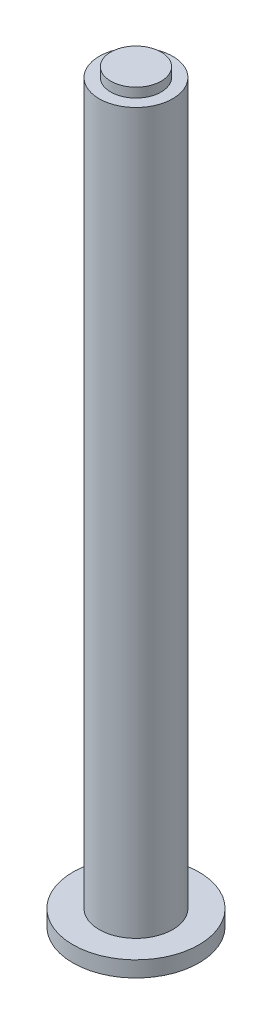
ISO-10303-21;
HEADER;
FILE_DESCRIPTION(('STEP AP214'),'2;1');
FILE_NAME('part.step','',(''),(''),'','','');
FILE_SCHEMA(('AUTOMOTIVE_DESIGN { 1 0 10303 214 1 1 1 1 }'));
ENDSEC;
DATA;
#1=APPLICATION_CONTEXT('core data for automotive mechanical design processes');
#2=APPLICATION_PROTOCOL_DEFINITION('international standard','automotive_design',2000,#1);
#3=PRODUCT_CONTEXT('',#1,'mechanical');
#4=PRODUCT('Part','Part','',(#3));
#5=PRODUCT_RELATED_PRODUCT_CATEGORY('part','',(#4));
#6=PRODUCT_DEFINITION_FORMATION('','',#4);
#7=PRODUCT_DEFINITION_CONTEXT('part definition',#1,'design');
#8=PRODUCT_DEFINITION('design','',#6,#7);
#9=PRODUCT_DEFINITION_SHAPE('','',#8);
#10=(LENGTH_UNIT() NAMED_UNIT(*) SI_UNIT(.MILLI.,.METRE.));
#11=(NAMED_UNIT(*) PLANE_ANGLE_UNIT() SI_UNIT($,.RADIAN.));
#12=(NAMED_UNIT(*) SI_UNIT($,.STERADIAN.) SOLID_ANGLE_UNIT());
#13=UNCERTAINTY_MEASURE_WITH_UNIT(LENGTH_MEASURE(1.E-05),#10,'distance_accuracy_value','');
#14=(GEOMETRIC_REPRESENTATION_CONTEXT(3) GLOBAL_UNCERTAINTY_ASSIGNED_CONTEXT((#13)) GLOBAL_UNIT_ASSIGNED_CONTEXT((#10,
#11,#12)) REPRESENTATION_CONTEXT('',''));
#15=CARTESIAN_POINT('',(0.,0.,0.));
#16=DIRECTION('',(0.,0.,1.));
#17=DIRECTION('',(1.,0.,0.));
#18=AXIS2_PLACEMENT_3D('',#15,#16,#17);
#19=CARTESIAN_POINT('',(0.,3.,0.));
#20=DIRECTION('',(0.,-1.,0.));
#21=DIRECTION('',(0.,0.,-1.));
#22=AXIS2_PLACEMENT_3D('',#19,#20,#21);
#23=CYLINDRICAL_SURFACE('',#22,12.);
#24=CARTESIAN_POINT('',(0.,3.,0.));
#25=DIRECTION('',(0.,1.,0.));
#26=DIRECTION('',(0.,0.,1.));
#27=AXIS2_PLACEMENT_3D('',#24,#25,#26);
#28=CIRCLE('',#27,12.);
#29=CARTESIAN_POINT('',(0.,3.,12.));
#30=VERTEX_POINT('',#29);
#31=EDGE_CURVE('E51',#30,#30,#28,.T.);
#32=ORIENTED_EDGE('',*,*,#31,.F.);
#33=EDGE_LOOP('',(#32));
#34=FACE_BOUND('',#33,.T.);
#35=CARTESIAN_POINT('',(0.,0.,0.));
#36=DIRECTION('',(0.,1.,0.));
#37=DIRECTION('',(0.,0.,1.));
#38=AXIS2_PLACEMENT_3D('',#35,#36,#37);
#39=CIRCLE('',#38,12.);
#40=CARTESIAN_POINT('',(0.,0.,12.));
#41=VERTEX_POINT('',#40);
#42=EDGE_CURVE('E46',#41,#41,#39,.T.);
#43=ORIENTED_EDGE('',*,*,#42,.T.);
#44=EDGE_LOOP('',(#43));
#45=FACE_BOUND('',#44,.T.);
#46=ADVANCED_FACE('F43',(#34,#45),#23,.T.);
#47=CARTESIAN_POINT('',(0.,3.,0.));
#48=DIRECTION('',(0.,1.,0.));
#49=DIRECTION('',(0.,0.,1.));
#50=AXIS2_PLACEMENT_3D('',#47,#48,#49);
#51=PLANE('',#50);
#52=CARTESIAN_POINT('',(0.,3.,0.));
#53=DIRECTION('',(0.,1.,0.));
#54=DIRECTION('',(0.,0.,1.));
#55=AXIS2_PLACEMENT_3D('',#52,#53,#54);
#56=CIRCLE('',#55,7.);
#57=CARTESIAN_POINT('',(0.,3.,7.));
#58=VERTEX_POINT('',#57);
#59=EDGE_CURVE('E63',#58,#58,#56,.F.);
#60=ORIENTED_EDGE('',*,*,#59,.T.);
#61=EDGE_LOOP('',(#60));
#62=FACE_BOUND('',#61,.T.);
#63=ORIENTED_EDGE('',*,*,#31,.T.);
#64=EDGE_LOOP('',(#63));
#65=FACE_BOUND('',#64,.T.);
#66=ADVANCED_FACE('F80',(#62,#65),#51,.T.);
#67=CARTESIAN_POINT('',(0.,0.,0.));
#68=DIRECTION('',(0.,1.,0.));
#69=DIRECTION('',(0.,0.,1.));
#70=AXIS2_PLACEMENT_3D('',#67,#68,#69);
#71=PLANE('',#70);
#72=ORIENTED_EDGE('',*,*,#42,.F.);
#73=EDGE_LOOP('',(#72));
#74=FACE_BOUND('',#73,.T.);
#75=ADVANCED_FACE('F74',(#74),#71,.F.);
#76=CARTESIAN_POINT('',(0.,140.,0.));
#77=DIRECTION('',(0.,-1.,0.));
#78=DIRECTION('',(0.,0.,-1.));
#79=AXIS2_PLACEMENT_3D('',#76,#77,#78);
#80=CYLINDRICAL_SURFACE('',#79,7.);
#81=ORIENTED_EDGE('',*,*,#59,.F.);
#82=EDGE_LOOP('',(#81));
#83=FACE_BOUND('',#82,.T.);
#84=CARTESIAN_POINT('',(0.,140.,0.));
#85=DIRECTION('',(0.,1.,0.));
#86=DIRECTION('',(0.,0.,1.));
#87=AXIS2_PLACEMENT_3D('',#84,#85,#86);
#88=CIRCLE('',#87,7.);
#89=CARTESIAN_POINT('',(0.,140.,7.));
#90=VERTEX_POINT('',#89);
#91=EDGE_CURVE('E58',#90,#90,#88,.T.);
#92=ORIENTED_EDGE('',*,*,#91,.F.);
#93=EDGE_LOOP('',(#92));
#94=FACE_BOUND('',#93,.T.);
#95=ADVANCED_FACE('F76',(#83,#94),#80,.T.);
#96=CARTESIAN_POINT('',(0.,140.,0.));
#97=DIRECTION('',(0.,1.,0.));
#98=DIRECTION('',(0.,0.,1.));
#99=AXIS2_PLACEMENT_3D('',#96,#97,#98);
#100=PLANE('',#99);
#101=CARTESIAN_POINT('',(0.,140.,0.));
#102=DIRECTION('',(0.,1.,0.));
#103=DIRECTION('',(0.,0.,1.));
#104=AXIS2_PLACEMENT_3D('',#101,#102,#103);
#105=CIRCLE('',#104,4.8);
#106=CARTESIAN_POINT('',(0.,140.,4.8));
#107=VERTEX_POINT('',#106);
#108=EDGE_CURVE('E10',#107,#107,#105,.T.);
#109=ORIENTED_EDGE('',*,*,#108,.F.);
#110=EDGE_LOOP('',(#109));
#111=FACE_BOUND('',#110,.T.);
#112=ORIENTED_EDGE('',*,*,#91,.T.);
#113=EDGE_LOOP('',(#112));
#114=FACE_BOUND('',#113,.T.);
#115=ADVANCED_FACE('F82',(#111,#114),#100,.T.);
#116=CARTESIAN_POINT('',(0.,141.8,0.));
#117=DIRECTION('',(0.,-1.,0.));
#118=DIRECTION('',(0.,0.,-1.));
#119=AXIS2_PLACEMENT_3D('',#116,#117,#118);
#120=CYLINDRICAL_SURFACE('',#119,4.8);
#121=CARTESIAN_POINT('',(0.,141.8,0.));
#122=DIRECTION('',(0.,1.,0.));
#123=DIRECTION('',(0.,0.,1.));
#124=AXIS2_PLACEMENT_3D('',#121,#122,#123);
#125=CIRCLE('',#124,4.8);
#126=CARTESIAN_POINT('',(0.,141.8,4.8));
#127=VERTEX_POINT('',#126);
#128=EDGE_CURVE('E56',#127,#127,#125,.T.);
#129=ORIENTED_EDGE('',*,*,#128,.F.);
#130=EDGE_LOOP('',(#129));
#131=FACE_BOUND('',#130,.T.);
#132=ORIENTED_EDGE('',*,*,#108,.T.);
#133=EDGE_LOOP('',(#132));
#134=FACE_BOUND('',#133,.T.);
#135=ADVANCED_FACE('F120',(#131,#134),#120,.T.);
#136=CARTESIAN_POINT('',(0.,141.8,0.));
#137=DIRECTION('',(0.,1.,0.));
#138=DIRECTION('',(0.,0.,1.));
#139=AXIS2_PLACEMENT_3D('',#136,#137,#138);
#140=PLANE('',#139);
#141=ORIENTED_EDGE('',*,*,#128,.T.);
#142=EDGE_LOOP('',(#141));
#143=FACE_BOUND('',#142,.T.);
#144=ADVANCED_FACE('F130',(#143),#140,.T.);
#145=CLOSED_SHELL('',(#46,#66,#75,#95,#115,#135,#144));
#146=MANIFOLD_SOLID_BREP('B2',#145);
#147=ADVANCED_BREP_SHAPE_REPRESENTATION('',(#18,#146),#14);
#148=SHAPE_DEFINITION_REPRESENTATION(#9,#147);
ENDSEC;
END-ISO-10303-21;
